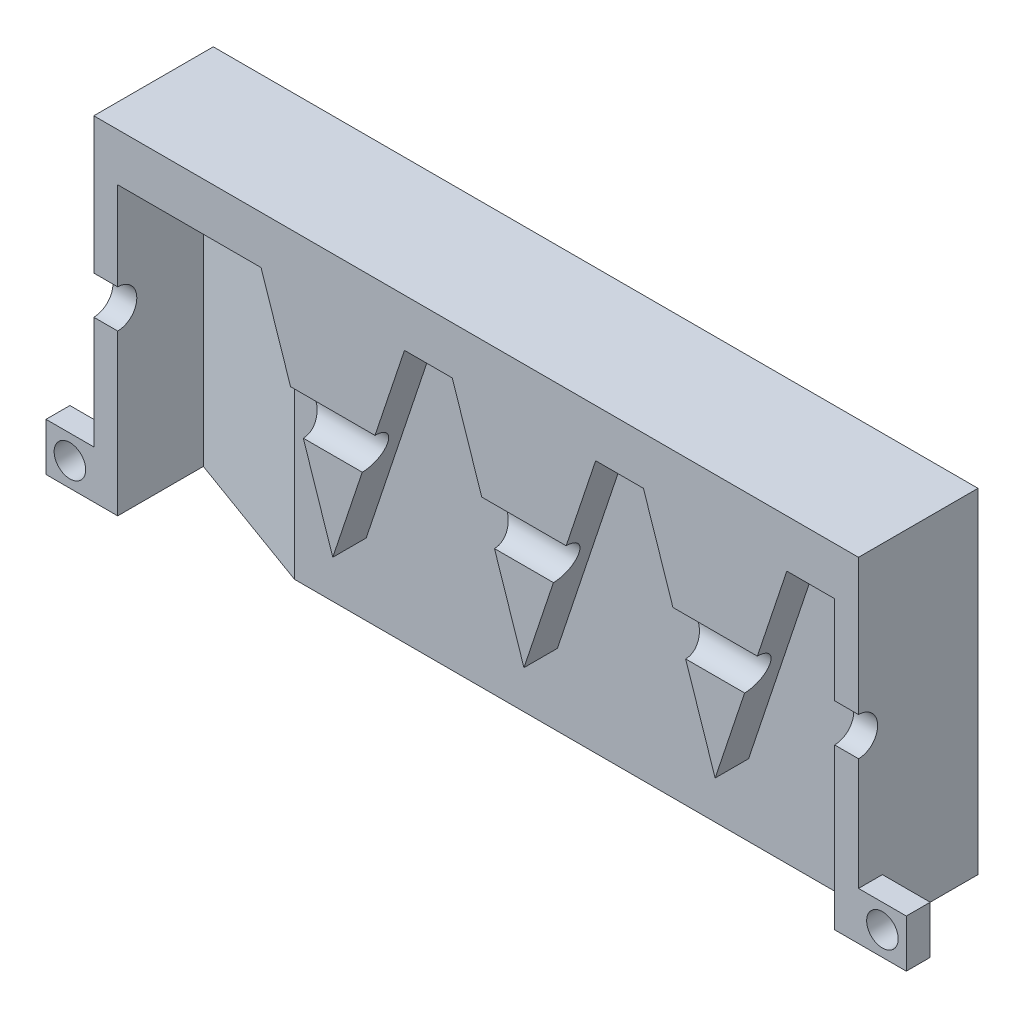
ISO-10303-21;
HEADER;
FILE_DESCRIPTION(('STEP AP214'),'2;1');
FILE_NAME('part.step','',(''),(''),'','','');
FILE_SCHEMA(('AUTOMOTIVE_DESIGN { 1 0 10303 214 1 1 1 1 }'));
ENDSEC;
DATA;
#1=APPLICATION_CONTEXT('core data for automotive mechanical design processes');
#2=APPLICATION_PROTOCOL_DEFINITION('international standard','automotive_design',2000,#1);
#3=PRODUCT_CONTEXT('',#1,'mechanical');
#4=PRODUCT('Part','Part','',(#3));
#5=PRODUCT_RELATED_PRODUCT_CATEGORY('part','',(#4));
#6=PRODUCT_DEFINITION_FORMATION('','',#4);
#7=PRODUCT_DEFINITION_CONTEXT('part definition',#1,'design');
#8=PRODUCT_DEFINITION('design','',#6,#7);
#9=PRODUCT_DEFINITION_SHAPE('','',#8);
#10=(LENGTH_UNIT() NAMED_UNIT(*) SI_UNIT(.MILLI.,.METRE.));
#11=(NAMED_UNIT(*) PLANE_ANGLE_UNIT() SI_UNIT($,.RADIAN.));
#12=(NAMED_UNIT(*) SI_UNIT($,.STERADIAN.) SOLID_ANGLE_UNIT());
#13=UNCERTAINTY_MEASURE_WITH_UNIT(LENGTH_MEASURE(1.E-05),#10,'distance_accuracy_value','');
#14=(GEOMETRIC_REPRESENTATION_CONTEXT(3) GLOBAL_UNCERTAINTY_ASSIGNED_CONTEXT((#13)) GLOBAL_UNIT_ASSIGNED_CONTEXT((#10,
#11,#12)) REPRESENTATION_CONTEXT('',''));
#15=CARTESIAN_POINT('',(0.,0.,0.));
#16=DIRECTION('',(0.,0.,1.));
#17=DIRECTION('',(1.,0.,0.));
#18=AXIS2_PLACEMENT_3D('',#15,#16,#17);
#19=CARTESIAN_POINT('',(0.,0.,-12.5));
#20=DIRECTION('',(0.,0.,1.));
#21=DIRECTION('',(1.,0.,0.));
#22=AXIS2_PLACEMENT_3D('',#19,#20,#21);
#23=PLANE('',#22);
#24=DIRECTION('',(-1.,0.,0.));
#25=VECTOR('',#24,1.);
#26=CARTESIAN_POINT('',(85.6568542494924,16.75,-12.5));
#27=LINE('',#26,#25);
#28=CARTESIAN_POINT('',(48.0833333333333,16.75,-12.5));
#29=VERTEX_POINT('',#28);
#30=CARTESIAN_POINT('',(41.9166666666667,16.75,-12.5));
#31=VERTEX_POINT('',#30);
#32=EDGE_CURVE('E403',#29,#31,#27,.T.);
#33=ORIENTED_EDGE('',*,*,#32,.T.);
#34=DIRECTION('',(0.316227766016838,-0.948683298050514,0.));
#35=VECTOR('',#34,1.);
#36=CARTESIAN_POINT('',(45.,7.50000000000001,-12.5));
#37=LINE('',#36,#35);
#38=CARTESIAN_POINT('',(45.,7.50000000000001,-12.5));
#39=VERTEX_POINT('',#38);
#40=EDGE_CURVE('E425',#31,#39,#37,.T.);
#41=ORIENTED_EDGE('',*,*,#40,.T.);
#42=DIRECTION('',(0.316227766016838,0.948683298050514,0.));
#43=VECTOR('',#42,1.);
#44=CARTESIAN_POINT('',(52.5,30.,-12.5));
#45=LINE('',#44,#43);
#46=EDGE_CURVE('E424',#39,#29,#45,.T.);
#47=ORIENTED_EDGE('',*,*,#46,.T.);
#48=EDGE_LOOP('',(#33,#41,#47));
#49=FACE_BOUND('',#48,.T.);
#50=ADVANCED_FACE('F32',(#49),#23,.T.);
#51=DIRECTION('',(-1.,0.,0.));
#52=VECTOR('',#51,1.);
#53=CARTESIAN_POINT('',(85.6568542494924,16.75,-12.5));
#54=LINE('',#53,#52);
#55=CARTESIAN_POINT('',(28.0833333333333,16.75,-12.5));
#56=VERTEX_POINT('',#55);
#57=CARTESIAN_POINT('',(21.9166666666667,16.75,-12.5));
#58=VERTEX_POINT('',#57);
#59=EDGE_CURVE('E397',#56,#58,#54,.T.);
#60=ORIENTED_EDGE('',*,*,#59,.T.);
#61=DIRECTION('',(0.316227766016838,-0.948683298050514,0.));
#62=VECTOR('',#61,1.);
#63=CARTESIAN_POINT('',(25.,7.50000000000001,-12.5));
#64=LINE('',#63,#62);
#65=CARTESIAN_POINT('',(25.,7.50000000000001,-12.5));
#66=VERTEX_POINT('',#65);
#67=EDGE_CURVE('E433',#58,#66,#64,.T.);
#68=ORIENTED_EDGE('',*,*,#67,.T.);
#69=DIRECTION('',(0.316227766016838,0.948683298050514,0.));
#70=VECTOR('',#69,1.);
#71=CARTESIAN_POINT('',(32.5,30.,-12.5));
#72=LINE('',#71,#70);
#73=EDGE_CURVE('E432',#66,#56,#72,.T.);
#74=ORIENTED_EDGE('',*,*,#73,.T.);
#75=EDGE_LOOP('',(#60,#68,#74));
#76=FACE_BOUND('',#75,.T.);
#77=ADVANCED_FACE('F629',(#76),#23,.T.);
#78=DIRECTION('',(-1.,0.,0.));
#79=VECTOR('',#78,1.);
#80=CARTESIAN_POINT('',(85.6568542494924,16.75,-12.5));
#81=LINE('',#80,#79);
#82=CARTESIAN_POINT('',(68.0833333333333,16.75,-12.5));
#83=VERTEX_POINT('',#82);
#84=CARTESIAN_POINT('',(61.9166666666667,16.75,-12.5));
#85=VERTEX_POINT('',#84);
#86=EDGE_CURVE('E390',#83,#85,#81,.T.);
#87=ORIENTED_EDGE('',*,*,#86,.T.);
#88=DIRECTION('',(0.316227766016838,-0.948683298050514,0.));
#89=VECTOR('',#88,1.);
#90=CARTESIAN_POINT('',(65.,7.50000000000001,-12.5));
#91=LINE('',#90,#89);
#92=CARTESIAN_POINT('',(65.,7.50000000000001,-12.5));
#93=VERTEX_POINT('',#92);
#94=EDGE_CURVE('E441',#85,#93,#91,.T.);
#95=ORIENTED_EDGE('',*,*,#94,.T.);
#96=DIRECTION('',(0.316227766016838,0.948683298050514,0.));
#97=VECTOR('',#96,1.);
#98=CARTESIAN_POINT('',(72.5,30.,-12.5));
#99=LINE('',#98,#97);
#100=EDGE_CURVE('E440',#93,#83,#99,.T.);
#101=ORIENTED_EDGE('',*,*,#100,.T.);
#102=EDGE_LOOP('',(#87,#95,#101));
#103=FACE_BOUND('',#102,.T.);
#104=ADVANCED_FACE('F620',(#103),#23,.T.);
#105=CARTESIAN_POINT('',(82.5,2.5,-12.5));
#106=DIRECTION('',(0.,0.,1.));
#107=DIRECTION('',(1.,0.,0.));
#108=AXIS2_PLACEMENT_3D('',#105,#106,#107);
#109=CIRCLE('',#108,1.65);
#110=CARTESIAN_POINT('',(84.15,2.5,-12.5));
#111=VERTEX_POINT('',#110);
#112=EDGE_CURVE('E415',#111,#111,#109,.F.);
#113=ORIENTED_EDGE('',*,*,#112,.T.);
#114=EDGE_LOOP('',(#113));
#115=FACE_BOUND('',#114,.T.);
#116=DIRECTION('',(1.,0.,0.));
#117=VECTOR('',#116,1.);
#118=CARTESIAN_POINT('',(85.,5.,-12.5));
#119=LINE('',#118,#117);
#120=CARTESIAN_POINT('',(80.,5.,-12.5));
#121=VERTEX_POINT('',#120);
#122=CARTESIAN_POINT('',(85.,5.,-12.5));
#123=VERTEX_POINT('',#122);
#124=EDGE_CURVE('E466',#121,#123,#119,.T.);
#125=ORIENTED_EDGE('',*,*,#124,.F.);
#126=DIRECTION('',(0.,1.,0.));
#127=VECTOR('',#126,1.);
#128=CARTESIAN_POINT('',(80.,35.,-12.5));
#129=LINE('',#128,#127);
#130=CARTESIAN_POINT('',(80.,16.75,-12.5));
#131=VERTEX_POINT('',#130);
#132=EDGE_CURVE('E384',#121,#131,#129,.T.);
#133=ORIENTED_EDGE('',*,*,#132,.T.);
#134=DIRECTION('',(-1.,0.,0.));
#135=VECTOR('',#134,1.);
#136=CARTESIAN_POINT('',(85.6568542494924,16.75,-12.5));
#137=LINE('',#136,#135);
#138=CARTESIAN_POINT('',(77.5,16.75,-12.5));
#139=VERTEX_POINT('',#138);
#140=EDGE_CURVE('E291',#131,#139,#137,.T.);
#141=ORIENTED_EDGE('',*,*,#140,.T.);
#142=DIRECTION('',(0.,1.,0.));
#143=VECTOR('',#142,1.);
#144=CARTESIAN_POINT('',(77.5,30.,-12.5));
#145=LINE('',#144,#143);
#146=CARTESIAN_POINT('',(77.5,0.,-12.5));
#147=VERTEX_POINT('',#146);
#148=EDGE_CURVE('E463',#147,#139,#145,.T.);
#149=ORIENTED_EDGE('',*,*,#148,.F.);
#150=DIRECTION('',(-1.,0.,0.));
#151=VECTOR('',#150,1.);
#152=CARTESIAN_POINT('',(0.,0.,-12.5));
#153=LINE('',#152,#151);
#154=CARTESIAN_POINT('',(85.,0.,-12.5));
#155=VERTEX_POINT('',#154);
#156=EDGE_CURVE('E449',#155,#147,#153,.T.);
#157=ORIENTED_EDGE('',*,*,#156,.F.);
#158=DIRECTION('',(0.,1.,0.));
#159=VECTOR('',#158,1.);
#160=CARTESIAN_POINT('',(85.,0.,-12.5));
#161=LINE('',#160,#159);
#162=EDGE_CURVE('E418',#155,#123,#161,.T.);
#163=ORIENTED_EDGE('',*,*,#162,.T.);
#164=EDGE_LOOP('',(#125,#133,#141,#149,#157,#163));
#165=FACE_BOUND('',#164,.T.);
#166=ADVANCED_FACE('F569',(#115,#165),#23,.T.);
#167=DIRECTION('',(-1.,0.,0.));
#168=VECTOR('',#167,1.);
#169=CARTESIAN_POINT('',(77.5,30.,-12.5));
#170=LINE('',#169,#168);
#171=CARTESIAN_POINT('',(57.5,30.,-12.5));
#172=VERTEX_POINT('',#171);
#173=CARTESIAN_POINT('',(52.5,30.,-12.5));
#174=VERTEX_POINT('',#173);
#175=EDGE_CURVE('E457',#172,#174,#170,.T.);
#176=ORIENTED_EDGE('',*,*,#175,.F.);
#177=CARTESIAN_POINT('',(60.5833333333333,20.75,-12.5));
#178=VERTEX_POINT('',#177);
#179=EDGE_CURVE('E444',#172,#178,#91,.T.);
#180=ORIENTED_EDGE('',*,*,#179,.T.);
#181=DIRECTION('',(-1.,0.,0.));
#182=VECTOR('',#181,1.);
#183=CARTESIAN_POINT('',(85.6568542494924,20.75,-12.5));
#184=LINE('',#183,#182);
#185=CARTESIAN_POINT('',(69.4166666666667,20.75,-12.5));
#186=VERTEX_POINT('',#185);
#187=EDGE_CURVE('E392',#178,#186,#184,.F.);
#188=ORIENTED_EDGE('',*,*,#187,.T.);
#189=CARTESIAN_POINT('',(72.5,30.,-12.5));
#190=VERTEX_POINT('',#189);
#191=EDGE_CURVE('E437',#186,#190,#99,.T.);
#192=ORIENTED_EDGE('',*,*,#191,.T.);
#193=DIRECTION('',(-1.,0.,0.));
#194=VECTOR('',#193,1.);
#195=CARTESIAN_POINT('',(77.5,30.,-12.5));
#196=LINE('',#195,#194);
#197=CARTESIAN_POINT('',(77.5,30.,-12.5));
#198=VERTEX_POINT('',#197);
#199=EDGE_CURVE('E460',#198,#190,#196,.T.);
#200=ORIENTED_EDGE('',*,*,#199,.F.);
#201=CARTESIAN_POINT('',(77.5,20.75,-12.5));
#202=VERTEX_POINT('',#201);
#203=EDGE_CURVE('E389',#202,#198,#145,.T.);
#204=ORIENTED_EDGE('',*,*,#203,.F.);
#205=DIRECTION('',(-1.,0.,0.));
#206=VECTOR('',#205,1.);
#207=CARTESIAN_POINT('',(85.6568542494924,20.75,-12.5));
#208=LINE('',#207,#206);
#209=CARTESIAN_POINT('',(80.,20.75,-12.5));
#210=VERTEX_POINT('',#209);
#211=EDGE_CURVE('E294',#202,#210,#208,.F.);
#212=ORIENTED_EDGE('',*,*,#211,.T.);
#213=CARTESIAN_POINT('',(80.,35.,-12.5));
#214=VERTEX_POINT('',#213);
#215=EDGE_CURVE('E380',#210,#214,#129,.T.);
#216=ORIENTED_EDGE('',*,*,#215,.T.);
#217=DIRECTION('',(-1.,0.,0.));
#218=VECTOR('',#217,1.);
#219=CARTESIAN_POINT('',(0.,35.,-12.5));
#220=LINE('',#219,#218);
#221=CARTESIAN_POINT('',(0.,35.,-12.5));
#222=VERTEX_POINT('',#221);
#223=EDGE_CURVE('E385',#214,#222,#220,.T.);
#224=ORIENTED_EDGE('',*,*,#223,.T.);
#225=DIRECTION('',(0.,-1.,0.));
#226=VECTOR('',#225,1.);
#227=CARTESIAN_POINT('',(0.,35.,-12.5));
#228=LINE('',#227,#226);
#229=CARTESIAN_POINT('',(0.,20.75,-12.5));
#230=VERTEX_POINT('',#229);
#231=EDGE_CURVE('E290',#222,#230,#228,.T.);
#232=ORIENTED_EDGE('',*,*,#231,.T.);
#233=DIRECTION('',(-1.,0.,0.));
#234=VECTOR('',#233,1.);
#235=CARTESIAN_POINT('',(85.6568542494924,20.75,-12.5));
#236=LINE('',#235,#234);
#237=CARTESIAN_POINT('',(2.5,20.75,-12.5));
#238=VERTEX_POINT('',#237);
#239=EDGE_CURVE('E266',#230,#238,#236,.F.);
#240=ORIENTED_EDGE('',*,*,#239,.T.);
#241=DIRECTION('',(0.,-1.,0.));
#242=VECTOR('',#241,1.);
#243=CARTESIAN_POINT('',(2.5,30.,-12.5));
#244=LINE('',#243,#242);
#245=CARTESIAN_POINT('',(2.5,30.,-12.5));
#246=VERTEX_POINT('',#245);
#247=EDGE_CURVE('E275',#246,#238,#244,.T.);
#248=ORIENTED_EDGE('',*,*,#247,.F.);
#249=DIRECTION('',(-1.,0.,0.));
#250=VECTOR('',#249,1.);
#251=CARTESIAN_POINT('',(77.5,30.,-12.5));
#252=LINE('',#251,#250);
#253=CARTESIAN_POINT('',(17.5,30.,-12.5));
#254=VERTEX_POINT('',#253);
#255=EDGE_CURVE('E283',#254,#246,#252,.T.);
#256=ORIENTED_EDGE('',*,*,#255,.F.);
#257=CARTESIAN_POINT('',(20.5833333333333,20.75,-12.5));
#258=VERTEX_POINT('',#257);
#259=EDGE_CURVE('E436',#254,#258,#64,.T.);
#260=ORIENTED_EDGE('',*,*,#259,.T.);
#261=DIRECTION('',(-1.,0.,0.));
#262=VECTOR('',#261,1.);
#263=CARTESIAN_POINT('',(85.6568542494924,20.75,-12.5));
#264=LINE('',#263,#262);
#265=CARTESIAN_POINT('',(29.4166666666667,20.75,-12.5));
#266=VERTEX_POINT('',#265);
#267=EDGE_CURVE('E400',#258,#266,#264,.F.);
#268=ORIENTED_EDGE('',*,*,#267,.T.);
#269=CARTESIAN_POINT('',(32.5,30.,-12.5));
#270=VERTEX_POINT('',#269);
#271=EDGE_CURVE('E429',#266,#270,#72,.T.);
#272=ORIENTED_EDGE('',*,*,#271,.T.);
#273=DIRECTION('',(-1.,0.,0.));
#274=VECTOR('',#273,1.);
#275=CARTESIAN_POINT('',(77.5,30.,-12.5));
#276=LINE('',#275,#274);
#277=CARTESIAN_POINT('',(37.5,30.,-12.5));
#278=VERTEX_POINT('',#277);
#279=EDGE_CURVE('E454',#278,#270,#276,.T.);
#280=ORIENTED_EDGE('',*,*,#279,.F.);
#281=CARTESIAN_POINT('',(40.5833333333333,20.75,-12.5));
#282=VERTEX_POINT('',#281);
#283=EDGE_CURVE('E428',#278,#282,#37,.T.);
#284=ORIENTED_EDGE('',*,*,#283,.T.);
#285=DIRECTION('',(-1.,0.,0.));
#286=VECTOR('',#285,1.);
#287=CARTESIAN_POINT('',(85.6568542494924,20.75,-12.5));
#288=LINE('',#287,#286);
#289=CARTESIAN_POINT('',(49.4166666666667,20.75,-12.5));
#290=VERTEX_POINT('',#289);
#291=EDGE_CURVE('E406',#282,#290,#288,.F.);
#292=ORIENTED_EDGE('',*,*,#291,.T.);
#293=EDGE_CURVE('E421',#290,#174,#45,.T.);
#294=ORIENTED_EDGE('',*,*,#293,.T.);
#295=EDGE_LOOP('',(#176,#180,#188,#192,#200,#204,#212,#216,#224,#232,#240,#248,#256,#260,#268,
#272,#280,#284,#292,#294));
#296=FACE_BOUND('',#295,.T.);
#297=ADVANCED_FACE('F287',(#296),#23,.T.);
#298=CARTESIAN_POINT('',(0.,16.75,-12.5));
#299=VERTEX_POINT('',#298);
#300=CARTESIAN_POINT('',(0.,5.,-12.5));
#301=VERTEX_POINT('',#300);
#302=EDGE_CURVE('E446',#299,#301,#228,.T.);
#303=ORIENTED_EDGE('',*,*,#302,.T.);
#304=DIRECTION('',(-1.,0.,0.));
#305=VECTOR('',#304,1.);
#306=CARTESIAN_POINT('',(-5.,5.,-12.5));
#307=LINE('',#306,#305);
#308=CARTESIAN_POINT('',(-5.,5.,-12.5));
#309=VERTEX_POINT('',#308);
#310=EDGE_CURVE('E412',#301,#309,#307,.T.);
#311=ORIENTED_EDGE('',*,*,#310,.T.);
#312=DIRECTION('',(0.,-1.,0.));
#313=VECTOR('',#312,1.);
#314=CARTESIAN_POINT('',(-5.,0.,-12.5));
#315=LINE('',#314,#313);
#316=CARTESIAN_POINT('',(-5.,0.,-12.5));
#317=VERTEX_POINT('',#316);
#318=EDGE_CURVE('E409',#309,#317,#315,.T.);
#319=ORIENTED_EDGE('',*,*,#318,.T.);
#320=CARTESIAN_POINT('',(2.5,0.,-12.5));
#321=VERTEX_POINT('',#320);
#322=EDGE_CURVE('E452',#321,#317,#153,.T.);
#323=ORIENTED_EDGE('',*,*,#322,.F.);
#324=CARTESIAN_POINT('',(2.5,16.75,-12.5));
#325=VERTEX_POINT('',#324);
#326=EDGE_CURVE('E282',#325,#321,#244,.T.);
#327=ORIENTED_EDGE('',*,*,#326,.F.);
#328=DIRECTION('',(-1.,0.,0.));
#329=VECTOR('',#328,1.);
#330=CARTESIAN_POINT('',(85.6568542494924,16.75,-12.5));
#331=LINE('',#330,#329);
#332=EDGE_CURVE('E268',#325,#299,#331,.T.);
#333=ORIENTED_EDGE('',*,*,#332,.T.);
#334=EDGE_LOOP('',(#303,#311,#319,#323,#327,#333));
#335=FACE_BOUND('',#334,.T.);
#336=CARTESIAN_POINT('',(-2.5,2.5,-12.5));
#337=DIRECTION('',(0.,0.,1.));
#338=DIRECTION('',(1.,0.,0.));
#339=AXIS2_PLACEMENT_3D('',#336,#337,#338);
#340=CIRCLE('',#339,1.65);
#341=CARTESIAN_POINT('',(-0.85,2.5,-12.5));
#342=VERTEX_POINT('',#341);
#343=EDGE_CURVE('E468',#342,#342,#340,.T.);
#344=ORIENTED_EDGE('',*,*,#343,.F.);
#345=EDGE_LOOP('',(#344));
#346=FACE_BOUND('',#345,.T.);
#347=ADVANCED_FACE('F544',(#335,#346),#23,.T.);
#348=CARTESIAN_POINT('',(0.,35.,0.));
#349=DIRECTION('',(1.,0.,0.));
#350=DIRECTION('',(0.,0.,-1.));
#351=AXIS2_PLACEMENT_3D('',#348,#349,#350);
#352=PLANE('',#351);
#353=ORIENTED_EDGE('',*,*,#231,.F.);
#354=DIRECTION('',(0.,0.,1.));
#355=VECTOR('',#354,1.);
#356=CARTESIAN_POINT('',(0.,35.,0.));
#357=LINE('',#356,#355);
#358=CARTESIAN_POINT('',(0.,35.,-25.));
#359=VERTEX_POINT('',#358);
#360=EDGE_CURVE('E301',#359,#222,#357,.T.);
#361=ORIENTED_EDGE('',*,*,#360,.F.);
#362=DIRECTION('',(0.,-1.,0.));
#363=VECTOR('',#362,1.);
#364=CARTESIAN_POINT('',(0.,35.,-25.));
#365=LINE('',#364,#363);
#366=CARTESIAN_POINT('',(0.,0.,-25.));
#367=VERTEX_POINT('',#366);
#368=EDGE_CURVE('E522',#359,#367,#365,.T.);
#369=ORIENTED_EDGE('',*,*,#368,.T.);
#370=DIRECTION('',(0.,0.,1.));
#371=VECTOR('',#370,1.);
#372=CARTESIAN_POINT('',(0.,0.,0.));
#373=LINE('',#372,#371);
#374=CARTESIAN_POINT('',(0.,0.,-15.));
#375=VERTEX_POINT('',#374);
#376=EDGE_CURVE('E48',#367,#375,#373,.T.);
#377=ORIENTED_EDGE('',*,*,#376,.T.);
#378=DIRECTION('',(0.,-1.,0.));
#379=VECTOR('',#378,1.);
#380=CARTESIAN_POINT('',(0.,5.,-15.));
#381=LINE('',#380,#379);
#382=CARTESIAN_POINT('',(0.,5.,-15.));
#383=VERTEX_POINT('',#382);
#384=EDGE_CURVE('E355',#383,#375,#381,.T.);
#385=ORIENTED_EDGE('',*,*,#384,.F.);
#386=DIRECTION('',(0.,0.,-1.));
#387=VECTOR('',#386,1.);
#388=CARTESIAN_POINT('',(0.,5.,-10.));
#389=LINE('',#388,#387);
#390=EDGE_CURVE('E356',#301,#383,#389,.T.);
#391=ORIENTED_EDGE('',*,*,#390,.F.);
#392=ORIENTED_EDGE('',*,*,#302,.F.);
#393=CARTESIAN_POINT('',(0.,18.75,-12.5));
#394=DIRECTION('',(-1.,0.,0.));
#395=DIRECTION('',(0.,0.,1.));
#396=AXIS2_PLACEMENT_3D('',#393,#394,#395);
#397=CIRCLE('',#396,2.);
#398=EDGE_CURVE('E11',#230,#299,#397,.T.);
#399=ORIENTED_EDGE('',*,*,#398,.F.);
#400=EDGE_LOOP('',(#353,#361,#369,#377,#385,#391,#392,#399));
#401=FACE_BOUND('',#400,.T.);
#402=ADVANCED_FACE('F539',(#401),#352,.F.);
#403=CARTESIAN_POINT('',(80.,35.,0.));
#404=DIRECTION('',(-1.,0.,0.));
#405=DIRECTION('',(0.,0.,1.));
#406=AXIS2_PLACEMENT_3D('',#403,#404,#405);
#407=PLANE('',#406);
#408=ORIENTED_EDGE('',*,*,#132,.F.);
#409=DIRECTION('',(0.,0.,-1.));
#410=VECTOR('',#409,1.);
#411=CARTESIAN_POINT('',(80.,5.,-10.));
#412=LINE('',#411,#410);
#413=CARTESIAN_POINT('',(80.,5.,-15.));
#414=VERTEX_POINT('',#413);
#415=EDGE_CURVE('E348',#121,#414,#412,.T.);
#416=ORIENTED_EDGE('',*,*,#415,.T.);
#417=DIRECTION('',(0.,-1.,0.));
#418=VECTOR('',#417,1.);
#419=CARTESIAN_POINT('',(80.,5.,-15.));
#420=LINE('',#419,#418);
#421=CARTESIAN_POINT('',(80.,0.,-15.));
#422=VERTEX_POINT('',#421);
#423=EDGE_CURVE('E347',#414,#422,#420,.T.);
#424=ORIENTED_EDGE('',*,*,#423,.T.);
#425=DIRECTION('',(0.,0.,-1.));
#426=VECTOR('',#425,1.);
#427=CARTESIAN_POINT('',(80.,0.,0.));
#428=LINE('',#427,#426);
#429=CARTESIAN_POINT('',(80.,0.,-25.));
#430=VERTEX_POINT('',#429);
#431=EDGE_CURVE('E305',#422,#430,#428,.T.);
#432=ORIENTED_EDGE('',*,*,#431,.T.);
#433=DIRECTION('',(0.,-1.,0.));
#434=VECTOR('',#433,1.);
#435=CARTESIAN_POINT('',(80.,35.,-25.));
#436=LINE('',#435,#434);
#437=CARTESIAN_POINT('',(80.,35.,-25.));
#438=VERTEX_POINT('',#437);
#439=EDGE_CURVE('E471',#438,#430,#436,.T.);
#440=ORIENTED_EDGE('',*,*,#439,.F.);
#441=DIRECTION('',(0.,0.,-1.));
#442=VECTOR('',#441,1.);
#443=CARTESIAN_POINT('',(80.,35.,0.));
#444=LINE('',#443,#442);
#445=EDGE_CURVE('E299',#214,#438,#444,.T.);
#446=ORIENTED_EDGE('',*,*,#445,.F.);
#447=ORIENTED_EDGE('',*,*,#215,.F.);
#448=CARTESIAN_POINT('',(80.,18.75,-12.5));
#449=DIRECTION('',(-1.,0.,0.));
#450=DIRECTION('',(0.,0.,1.));
#451=AXIS2_PLACEMENT_3D('',#448,#449,#450);
#452=CIRCLE('',#451,2.);
#453=EDGE_CURVE('E41',#131,#210,#452,.F.);
#454=ORIENTED_EDGE('',*,*,#453,.F.);
#455=EDGE_LOOP('',(#408,#416,#424,#432,#440,#446,#447,#454));
#456=FACE_BOUND('',#455,.T.);
#457=ADVANCED_FACE('F381',(#456),#407,.F.);
#458=CARTESIAN_POINT('',(0.,35.,0.));
#459=DIRECTION('',(0.,-1.,0.));
#460=DIRECTION('',(0.,0.,-1.));
#461=AXIS2_PLACEMENT_3D('',#458,#459,#460);
#462=PLANE('',#461);
#463=ORIENTED_EDGE('',*,*,#223,.F.);
#464=ORIENTED_EDGE('',*,*,#445,.T.);
#465=DIRECTION('',(-1.,0.,0.));
#466=VECTOR('',#465,1.);
#467=CARTESIAN_POINT('',(0.,35.,-25.));
#468=LINE('',#467,#466);
#469=EDGE_CURVE('E302',#438,#359,#468,.T.);
#470=ORIENTED_EDGE('',*,*,#469,.T.);
#471=ORIENTED_EDGE('',*,*,#360,.T.);
#472=EDGE_LOOP('',(#463,#464,#470,#471));
#473=FACE_BOUND('',#472,.T.);
#474=ADVANCED_FACE('F34',(#473),#462,.F.);
#475=CARTESIAN_POINT('',(0.,0.,0.));
#476=DIRECTION('',(0.,-1.,0.));
#477=DIRECTION('',(0.,0.,-1.));
#478=AXIS2_PLACEMENT_3D('',#475,#476,#477);
#479=PLANE('',#478);
#480=DIRECTION('',(0.,0.,-1.));
#481=VECTOR('',#480,1.);
#482=CARTESIAN_POINT('',(85.,0.,-10.));
#483=LINE('',#482,#481);
#484=CARTESIAN_POINT('',(85.,0.,-15.));
#485=VERTEX_POINT('',#484);
#486=EDGE_CURVE('E76',#155,#485,#483,.T.);
#487=ORIENTED_EDGE('',*,*,#486,.F.);
#488=ORIENTED_EDGE('',*,*,#156,.T.);
#489=DIRECTION('',(0.,0.,1.));
#490=VECTOR('',#489,1.);
#491=CARTESIAN_POINT('',(77.5,0.,-16.));
#492=LINE('',#491,#490);
#493=CARTESIAN_POINT('',(77.5,0.,-16.));
#494=VERTEX_POINT('',#493);
#495=EDGE_CURVE('E311',#494,#147,#492,.T.);
#496=ORIENTED_EDGE('',*,*,#495,.F.);
#497=DIRECTION('',(-1.,0.,0.));
#498=VECTOR('',#497,1.);
#499=CARTESIAN_POINT('',(77.5,0.,-16.));
#500=LINE('',#499,#498);
#501=CARTESIAN_POINT('',(17.5,0.,-16.));
#502=VERTEX_POINT('',#501);
#503=EDGE_CURVE('E318',#494,#502,#500,.T.);
#504=ORIENTED_EDGE('',*,*,#503,.T.);
#505=DIRECTION('',(0.939692620785911,0.,0.342020143325662));
#506=VECTOR('',#505,1.);
#507=CARTESIAN_POINT('',(2.5,0.,-21.4595535139929));
#508=LINE('',#507,#506);
#509=CARTESIAN_POINT('',(2.5,0.,-21.4595535139929));
#510=VERTEX_POINT('',#509);
#511=EDGE_CURVE('E342',#510,#502,#508,.T.);
#512=ORIENTED_EDGE('',*,*,#511,.F.);
#513=DIRECTION('',(0.,0.,1.));
#514=VECTOR('',#513,1.);
#515=CARTESIAN_POINT('',(2.5,0.,-16.));
#516=LINE('',#515,#514);
#517=EDGE_CURVE('E314',#510,#321,#516,.T.);
#518=ORIENTED_EDGE('',*,*,#517,.T.);
#519=ORIENTED_EDGE('',*,*,#322,.T.);
#520=DIRECTION('',(0.,0.,-1.));
#521=VECTOR('',#520,1.);
#522=CARTESIAN_POINT('',(-5.,0.,-10.));
#523=LINE('',#522,#521);
#524=CARTESIAN_POINT('',(-5.,0.,-15.));
#525=VERTEX_POINT('',#524);
#526=EDGE_CURVE('E351',#317,#525,#523,.T.);
#527=ORIENTED_EDGE('',*,*,#526,.T.);
#528=DIRECTION('',(1.,0.,0.));
#529=VECTOR('',#528,1.);
#530=CARTESIAN_POINT('',(-5.,0.,-15.));
#531=LINE('',#530,#529);
#532=EDGE_CURVE('E475',#525,#375,#531,.T.);
#533=ORIENTED_EDGE('',*,*,#532,.T.);
#534=ORIENTED_EDGE('',*,*,#376,.F.);
#535=DIRECTION('',(-1.,0.,0.));
#536=VECTOR('',#535,1.);
#537=CARTESIAN_POINT('',(0.,0.,-25.));
#538=LINE('',#537,#536);
#539=EDGE_CURVE('E304',#430,#367,#538,.T.);
#540=ORIENTED_EDGE('',*,*,#539,.F.);
#541=ORIENTED_EDGE('',*,*,#431,.F.);
#542=DIRECTION('',(-1.,0.,0.));
#543=VECTOR('',#542,1.);
#544=CARTESIAN_POINT('',(85.,0.,-15.));
#545=LINE('',#544,#543);
#546=EDGE_CURVE('E487',#485,#422,#545,.T.);
#547=ORIENTED_EDGE('',*,*,#546,.F.);
#548=EDGE_LOOP('',(#487,#488,#496,#504,#512,#518,#519,#527,#533,#534,#540,#541,#547));
#549=FACE_BOUND('',#548,.T.);
#550=ADVANCED_FACE('F533',(#549),#479,.T.);
#551=CARTESIAN_POINT('',(77.5,30.,-16.));
#552=DIRECTION('',(0.,-1.,0.));
#553=DIRECTION('',(-1.,0.,0.));
#554=AXIS2_PLACEMENT_3D('',#551,#552,#553);
#555=PLANE('',#554);
#556=DIRECTION('',(0.,0.,1.));
#557=VECTOR('',#556,1.);
#558=CARTESIAN_POINT('',(17.5,30.,-43.0416345659799));
#559=LINE('',#558,#557);
#560=CARTESIAN_POINT('',(17.5,30.,-16.));
#561=VERTEX_POINT('',#560);
#562=EDGE_CURVE('E340',#561,#254,#559,.T.);
#563=ORIENTED_EDGE('',*,*,#562,.T.);
#564=ORIENTED_EDGE('',*,*,#255,.T.);
#565=DIRECTION('',(0.,0.,1.));
#566=VECTOR('',#565,1.);
#567=CARTESIAN_POINT('',(2.5,30.,-16.));
#568=LINE('',#567,#566);
#569=CARTESIAN_POINT('',(2.5,30.,-21.4595535139929));
#570=VERTEX_POINT('',#569);
#571=EDGE_CURVE('E278',#570,#246,#568,.T.);
#572=ORIENTED_EDGE('',*,*,#571,.F.);
#573=DIRECTION('',(-0.939692620785911,0.,-0.342020143325662));
#574=VECTOR('',#573,1.);
#575=CARTESIAN_POINT('',(2.5,30.,-21.4595535139929));
#576=LINE('',#575,#574);
#577=EDGE_CURVE('E490',#561,#570,#576,.T.);
#578=ORIENTED_EDGE('',*,*,#577,.F.);
#579=EDGE_LOOP('',(#563,#564,#572,#578));
#580=FACE_BOUND('',#579,.T.);
#581=ADVANCED_FACE('F577',(#580),#555,.T.);
#582=CARTESIAN_POINT('',(2.5,30.,-16.));
#583=DIRECTION('',(1.,0.,0.));
#584=DIRECTION('',(0.,-1.,0.));
#585=AXIS2_PLACEMENT_3D('',#582,#583,#584);
#586=PLANE('',#585);
#587=ORIENTED_EDGE('',*,*,#571,.T.);
#588=ORIENTED_EDGE('',*,*,#247,.T.);
#589=CARTESIAN_POINT('',(2.5,18.75,-12.5));
#590=DIRECTION('',(1.,0.,0.));
#591=DIRECTION('',(0.,0.,-1.));
#592=AXIS2_PLACEMENT_3D('',#589,#590,#591);
#593=CIRCLE('',#592,2.);
#594=EDGE_CURVE('E262',#325,#238,#593,.T.);
#595=ORIENTED_EDGE('',*,*,#594,.F.);
#596=ORIENTED_EDGE('',*,*,#326,.T.);
#597=ORIENTED_EDGE('',*,*,#517,.F.);
#598=DIRECTION('',(0.,1.,0.));
#599=VECTOR('',#598,1.);
#600=CARTESIAN_POINT('',(2.5,-15.9626665871386,-21.4595535139929));
#601=LINE('',#600,#599);
#602=EDGE_CURVE('E496',#510,#570,#601,.T.);
#603=ORIENTED_EDGE('',*,*,#602,.T.);
#604=EDGE_LOOP('',(#587,#588,#595,#596,#597,#603));
#605=FACE_BOUND('',#604,.T.);
#606=ADVANCED_FACE('F276',(#605),#586,.T.);
#607=DIRECTION('',(0.,0.,1.));
#608=VECTOR('',#607,1.);
#609=CARTESIAN_POINT('',(37.5,30.,-43.0416345659799));
#610=LINE('',#609,#608);
#611=CARTESIAN_POINT('',(37.5,30.,-16.));
#612=VERTEX_POINT('',#611);
#613=EDGE_CURVE('E332',#612,#278,#610,.T.);
#614=ORIENTED_EDGE('',*,*,#613,.T.);
#615=ORIENTED_EDGE('',*,*,#279,.T.);
#616=DIRECTION('',(0.,0.,1.));
#617=VECTOR('',#616,1.);
#618=CARTESIAN_POINT('',(32.5,30.,-43.0416345659799));
#619=LINE('',#618,#617);
#620=CARTESIAN_POINT('',(32.5,30.,-16.));
#621=VERTEX_POINT('',#620);
#622=EDGE_CURVE('E335',#621,#270,#619,.T.);
#623=ORIENTED_EDGE('',*,*,#622,.F.);
#624=DIRECTION('',(1.,0.,0.));
#625=VECTOR('',#624,1.);
#626=CARTESIAN_POINT('',(77.5,30.,-16.));
#627=LINE('',#626,#625);
#628=EDGE_CURVE('E516',#621,#612,#627,.T.);
#629=ORIENTED_EDGE('',*,*,#628,.T.);
#630=EDGE_LOOP('',(#614,#615,#623,#629));
#631=FACE_BOUND('',#630,.T.);
#632=ADVANCED_FACE('F585',(#631),#555,.T.);
#633=DIRECTION('',(0.,0.,1.));
#634=VECTOR('',#633,1.);
#635=CARTESIAN_POINT('',(57.5,30.,-43.0416345659799));
#636=LINE('',#635,#634);
#637=CARTESIAN_POINT('',(57.5,30.,-16.));
#638=VERTEX_POINT('',#637);
#639=EDGE_CURVE('E324',#638,#172,#636,.T.);
#640=ORIENTED_EDGE('',*,*,#639,.T.);
#641=ORIENTED_EDGE('',*,*,#175,.T.);
#642=DIRECTION('',(0.,0.,1.));
#643=VECTOR('',#642,1.);
#644=CARTESIAN_POINT('',(52.5,30.,-43.0416345659799));
#645=LINE('',#644,#643);
#646=CARTESIAN_POINT('',(52.5,30.,-16.));
#647=VERTEX_POINT('',#646);
#648=EDGE_CURVE('E327',#647,#174,#645,.T.);
#649=ORIENTED_EDGE('',*,*,#648,.F.);
#650=EDGE_CURVE('E514',#647,#638,#627,.T.);
#651=ORIENTED_EDGE('',*,*,#650,.T.);
#652=EDGE_LOOP('',(#640,#641,#649,#651));
#653=FACE_BOUND('',#652,.T.);
#654=ADVANCED_FACE('F749',(#653),#555,.T.);
#655=DIRECTION('',(0.,0.,1.));
#656=VECTOR('',#655,1.);
#657=CARTESIAN_POINT('',(77.5,30.,-16.));
#658=LINE('',#657,#656);
#659=CARTESIAN_POINT('',(77.5,30.,-16.));
#660=VERTEX_POINT('',#659);
#661=EDGE_CURVE('E308',#660,#198,#658,.T.);
#662=ORIENTED_EDGE('',*,*,#661,.T.);
#663=ORIENTED_EDGE('',*,*,#199,.T.);
#664=DIRECTION('',(0.,0.,1.));
#665=VECTOR('',#664,1.);
#666=CARTESIAN_POINT('',(72.5,30.,-43.0416345659799));
#667=LINE('',#666,#665);
#668=CARTESIAN_POINT('',(72.5,30.,-16.));
#669=VERTEX_POINT('',#668);
#670=EDGE_CURVE('E319',#669,#190,#667,.T.);
#671=ORIENTED_EDGE('',*,*,#670,.F.);
#672=EDGE_CURVE('E511',#669,#660,#627,.T.);
#673=ORIENTED_EDGE('',*,*,#672,.T.);
#674=EDGE_LOOP('',(#662,#663,#671,#673));
#675=FACE_BOUND('',#674,.T.);
#676=ADVANCED_FACE('F584',(#675),#555,.T.);
#677=CARTESIAN_POINT('',(77.5,30.,-16.));
#678=DIRECTION('',(-1.,0.,0.));
#679=DIRECTION('',(0.,1.,0.));
#680=AXIS2_PLACEMENT_3D('',#677,#678,#679);
#681=PLANE('',#680);
#682=ORIENTED_EDGE('',*,*,#495,.T.);
#683=ORIENTED_EDGE('',*,*,#148,.T.);
#684=CARTESIAN_POINT('',(77.5,18.75,-12.5));
#685=DIRECTION('',(-1.,0.,0.));
#686=DIRECTION('',(0.,0.,1.));
#687=AXIS2_PLACEMENT_3D('',#684,#685,#686);
#688=CIRCLE('',#687,2.);
#689=EDGE_CURVE('E271',#202,#139,#688,.T.);
#690=ORIENTED_EDGE('',*,*,#689,.F.);
#691=ORIENTED_EDGE('',*,*,#203,.T.);
#692=ORIENTED_EDGE('',*,*,#661,.F.);
#693=DIRECTION('',(0.,-1.,0.));
#694=VECTOR('',#693,1.);
#695=CARTESIAN_POINT('',(77.5,30.,-16.));
#696=LINE('',#695,#694);
#697=EDGE_CURVE('E517',#660,#494,#696,.T.);
#698=ORIENTED_EDGE('',*,*,#697,.T.);
#699=EDGE_LOOP('',(#682,#683,#690,#691,#692,#698));
#700=FACE_BOUND('',#699,.T.);
#701=ADVANCED_FACE('F679',(#700),#681,.T.);
#702=CARTESIAN_POINT('',(65.,7.50000000000001,-43.0416345659799));
#703=DIRECTION('',(0.948683298050514,0.316227766016838,0.));
#704=DIRECTION('',(0.316227766016838,-0.948683298050514,0.));
#705=AXIS2_PLACEMENT_3D('',#702,#703,#704);
#706=PLANE('',#705);
#707=ORIENTED_EDGE('',*,*,#179,.F.);
#708=ORIENTED_EDGE('',*,*,#639,.F.);
#709=DIRECTION('',(0.316227766016838,-0.948683298050514,0.));
#710=VECTOR('',#709,1.);
#711=CARTESIAN_POINT('',(65.,7.50000000000001,-16.));
#712=LINE('',#711,#710);
#713=CARTESIAN_POINT('',(65.,7.50000000000001,-16.));
#714=VERTEX_POINT('',#713);
#715=EDGE_CURVE('E322',#638,#714,#712,.T.);
#716=ORIENTED_EDGE('',*,*,#715,.T.);
#717=DIRECTION('',(0.,0.,1.));
#718=VECTOR('',#717,1.);
#719=CARTESIAN_POINT('',(65.,7.50000000000001,-43.0416345659799));
#720=LINE('',#719,#718);
#721=EDGE_CURVE('E321',#714,#93,#720,.T.);
#722=ORIENTED_EDGE('',*,*,#721,.T.);
#723=ORIENTED_EDGE('',*,*,#94,.F.);
#724=CARTESIAN_POINT('',(61.25,18.75,-12.5));
#725=DIRECTION('',(0.948683298050514,0.316227766016838,0.));
#726=DIRECTION('',(-0.316227766016838,0.948683298050514,0.));
#727=AXIS2_PLACEMENT_3D('',#724,#725,#726);
#728=ELLIPSE('',#727,2.10818510677892,2.);
#729=EDGE_CURVE('E359',#85,#178,#728,.T.);
#730=ORIENTED_EDGE('',*,*,#729,.T.);
#731=EDGE_LOOP('',(#707,#708,#716,#722,#723,#730));
#732=FACE_BOUND('',#731,.T.);
#733=ADVANCED_FACE('F676',(#732),#706,.F.);
#734=CARTESIAN_POINT('',(72.5,30.,-43.0416345659799));
#735=DIRECTION('',(-0.948683298050514,0.316227766016838,0.));
#736=DIRECTION('',(0.316227766016838,0.948683298050514,0.));
#737=AXIS2_PLACEMENT_3D('',#734,#735,#736);
#738=PLANE('',#737);
#739=ORIENTED_EDGE('',*,*,#100,.F.);
#740=ORIENTED_EDGE('',*,*,#721,.F.);
#741=DIRECTION('',(0.316227766016838,0.948683298050514,0.));
#742=VECTOR('',#741,1.);
#743=CARTESIAN_POINT('',(72.5,30.,-16.));
#744=LINE('',#743,#742);
#745=EDGE_CURVE('E508',#714,#669,#744,.T.);
#746=ORIENTED_EDGE('',*,*,#745,.T.);
#747=ORIENTED_EDGE('',*,*,#670,.T.);
#748=ORIENTED_EDGE('',*,*,#191,.F.);
#749=CARTESIAN_POINT('',(68.75,18.75,-12.5));
#750=DIRECTION('',(-0.948683298050514,0.316227766016838,0.));
#751=DIRECTION('',(-0.316227766016838,-0.948683298050514,0.));
#752=AXIS2_PLACEMENT_3D('',#749,#750,#751);
#753=ELLIPSE('',#752,2.10818510677892,2.);
#754=EDGE_CURVE('E361',#186,#83,#753,.T.);
#755=ORIENTED_EDGE('',*,*,#754,.T.);
#756=EDGE_LOOP('',(#739,#740,#746,#747,#748,#755));
#757=FACE_BOUND('',#756,.T.);
#758=ADVANCED_FACE('F672',(#757),#738,.F.);
#759=CARTESIAN_POINT('',(25.,7.50000000000001,-43.0416345659799));
#760=DIRECTION('',(0.948683298050514,0.316227766016838,0.));
#761=DIRECTION('',(0.316227766016838,-0.948683298050514,0.));
#762=AXIS2_PLACEMENT_3D('',#759,#760,#761);
#763=PLANE('',#762);
#764=ORIENTED_EDGE('',*,*,#259,.F.);
#765=ORIENTED_EDGE('',*,*,#562,.F.);
#766=DIRECTION('',(0.316227766016838,-0.948683298050514,0.));
#767=VECTOR('',#766,1.);
#768=CARTESIAN_POINT('',(25.,7.50000000000001,-16.));
#769=LINE('',#768,#767);
#770=CARTESIAN_POINT('',(25.,7.50000000000001,-16.));
#771=VERTEX_POINT('',#770);
#772=EDGE_CURVE('E338',#561,#771,#769,.T.);
#773=ORIENTED_EDGE('',*,*,#772,.T.);
#774=DIRECTION('',(0.,0.,1.));
#775=VECTOR('',#774,1.);
#776=CARTESIAN_POINT('',(25.,7.50000000000001,-43.0416345659799));
#777=LINE('',#776,#775);
#778=EDGE_CURVE('E337',#771,#66,#777,.T.);
#779=ORIENTED_EDGE('',*,*,#778,.T.);
#780=ORIENTED_EDGE('',*,*,#67,.F.);
#781=CARTESIAN_POINT('',(21.25,18.75,-12.5));
#782=DIRECTION('',(0.948683298050514,0.316227766016838,0.));
#783=DIRECTION('',(-0.316227766016838,0.948683298050514,0.));
#784=AXIS2_PLACEMENT_3D('',#781,#782,#783);
#785=ELLIPSE('',#784,2.10818510677892,2.);
#786=EDGE_CURVE('E363',#58,#258,#785,.T.);
#787=ORIENTED_EDGE('',*,*,#786,.T.);
#788=EDGE_LOOP('',(#764,#765,#773,#779,#780,#787));
#789=FACE_BOUND('',#788,.T.);
#790=ADVANCED_FACE('F668',(#789),#763,.F.);
#791=CARTESIAN_POINT('',(32.5,30.,-43.0416345659799));
#792=DIRECTION('',(-0.948683298050514,0.316227766016838,0.));
#793=DIRECTION('',(0.316227766016838,0.948683298050514,0.));
#794=AXIS2_PLACEMENT_3D('',#791,#792,#793);
#795=PLANE('',#794);
#796=ORIENTED_EDGE('',*,*,#73,.F.);
#797=ORIENTED_EDGE('',*,*,#778,.F.);
#798=DIRECTION('',(0.316227766016838,0.948683298050514,0.));
#799=VECTOR('',#798,1.);
#800=CARTESIAN_POINT('',(32.5,30.,-16.));
#801=LINE('',#800,#799);
#802=EDGE_CURVE('E334',#771,#621,#801,.T.);
#803=ORIENTED_EDGE('',*,*,#802,.T.);
#804=ORIENTED_EDGE('',*,*,#622,.T.);
#805=ORIENTED_EDGE('',*,*,#271,.F.);
#806=CARTESIAN_POINT('',(28.75,18.75,-12.5));
#807=DIRECTION('',(-0.948683298050514,0.316227766016838,0.));
#808=DIRECTION('',(-0.316227766016838,-0.948683298050514,0.));
#809=AXIS2_PLACEMENT_3D('',#806,#807,#808);
#810=ELLIPSE('',#809,2.10818510677892,2.);
#811=EDGE_CURVE('E365',#266,#56,#810,.T.);
#812=ORIENTED_EDGE('',*,*,#811,.T.);
#813=EDGE_LOOP('',(#796,#797,#803,#804,#805,#812));
#814=FACE_BOUND('',#813,.T.);
#815=ADVANCED_FACE('F660',(#814),#795,.F.);
#816=CARTESIAN_POINT('',(45.,7.50000000000001,-43.0416345659799));
#817=DIRECTION('',(0.948683298050514,0.316227766016838,0.));
#818=DIRECTION('',(0.316227766016838,-0.948683298050514,0.));
#819=AXIS2_PLACEMENT_3D('',#816,#817,#818);
#820=PLANE('',#819);
#821=ORIENTED_EDGE('',*,*,#283,.F.);
#822=ORIENTED_EDGE('',*,*,#613,.F.);
#823=DIRECTION('',(0.316227766016838,-0.948683298050514,0.));
#824=VECTOR('',#823,1.);
#825=CARTESIAN_POINT('',(45.,7.50000000000001,-16.));
#826=LINE('',#825,#824);
#827=CARTESIAN_POINT('',(45.,7.50000000000001,-16.));
#828=VERTEX_POINT('',#827);
#829=EDGE_CURVE('E330',#612,#828,#826,.T.);
#830=ORIENTED_EDGE('',*,*,#829,.T.);
#831=DIRECTION('',(0.,0.,1.));
#832=VECTOR('',#831,1.);
#833=CARTESIAN_POINT('',(45.,7.50000000000001,-43.0416345659799));
#834=LINE('',#833,#832);
#835=EDGE_CURVE('E329',#828,#39,#834,.T.);
#836=ORIENTED_EDGE('',*,*,#835,.T.);
#837=ORIENTED_EDGE('',*,*,#40,.F.);
#838=CARTESIAN_POINT('',(41.25,18.75,-12.5));
#839=DIRECTION('',(0.948683298050514,0.316227766016838,0.));
#840=DIRECTION('',(-0.316227766016838,0.948683298050514,0.));
#841=AXIS2_PLACEMENT_3D('',#838,#839,#840);
#842=ELLIPSE('',#841,2.10818510677892,2.);
#843=EDGE_CURVE('E367',#31,#282,#842,.T.);
#844=ORIENTED_EDGE('',*,*,#843,.T.);
#845=EDGE_LOOP('',(#821,#822,#830,#836,#837,#844));
#846=FACE_BOUND('',#845,.T.);
#847=ADVANCED_FACE('F656',(#846),#820,.F.);
#848=CARTESIAN_POINT('',(52.5,30.,-43.0416345659799));
#849=DIRECTION('',(-0.948683298050514,0.316227766016838,0.));
#850=DIRECTION('',(0.316227766016838,0.948683298050514,0.));
#851=AXIS2_PLACEMENT_3D('',#848,#849,#850);
#852=PLANE('',#851);
#853=ORIENTED_EDGE('',*,*,#46,.F.);
#854=ORIENTED_EDGE('',*,*,#835,.F.);
#855=DIRECTION('',(0.316227766016838,0.948683298050514,0.));
#856=VECTOR('',#855,1.);
#857=CARTESIAN_POINT('',(52.5,30.,-16.));
#858=LINE('',#857,#856);
#859=EDGE_CURVE('E326',#828,#647,#858,.T.);
#860=ORIENTED_EDGE('',*,*,#859,.T.);
#861=ORIENTED_EDGE('',*,*,#648,.T.);
#862=ORIENTED_EDGE('',*,*,#293,.F.);
#863=CARTESIAN_POINT('',(48.75,18.75,-12.5));
#864=DIRECTION('',(-0.948683298050514,0.316227766016838,0.));
#865=DIRECTION('',(-0.316227766016838,-0.948683298050514,0.));
#866=AXIS2_PLACEMENT_3D('',#863,#864,#865);
#867=ELLIPSE('',#866,2.10818510677892,2.);
#868=EDGE_CURVE('E369',#290,#29,#867,.T.);
#869=ORIENTED_EDGE('',*,*,#868,.T.);
#870=EDGE_LOOP('',(#853,#854,#860,#861,#862,#869));
#871=FACE_BOUND('',#870,.T.);
#872=ADVANCED_FACE('F652',(#871),#852,.F.);
#873=CARTESIAN_POINT('',(85.,5.,-10.));
#874=DIRECTION('',(0.,1.,0.));
#875=DIRECTION('',(0.,0.,1.));
#876=AXIS2_PLACEMENT_3D('',#873,#874,#875);
#877=PLANE('',#876);
#878=ORIENTED_EDGE('',*,*,#415,.F.);
#879=ORIENTED_EDGE('',*,*,#124,.T.);
#880=DIRECTION('',(0.,0.,-1.));
#881=VECTOR('',#880,1.);
#882=CARTESIAN_POINT('',(85.,5.,-10.));
#883=LINE('',#882,#881);
#884=CARTESIAN_POINT('',(85.,5.,-15.));
#885=VERTEX_POINT('',#884);
#886=EDGE_CURVE('E68',#123,#885,#883,.T.);
#887=ORIENTED_EDGE('',*,*,#886,.T.);
#888=DIRECTION('',(-1.,0.,0.));
#889=VECTOR('',#888,1.);
#890=CARTESIAN_POINT('',(85.,5.,-15.));
#891=LINE('',#890,#889);
#892=EDGE_CURVE('E345',#885,#414,#891,.T.);
#893=ORIENTED_EDGE('',*,*,#892,.T.);
#894=EDGE_LOOP('',(#878,#879,#887,#893));
#895=FACE_BOUND('',#894,.T.);
#896=ADVANCED_FACE('F655',(#895),#877,.T.);
#897=CARTESIAN_POINT('',(85.,0.,0.));
#898=DIRECTION('',(-1.,0.,0.));
#899=DIRECTION('',(0.,0.,1.));
#900=AXIS2_PLACEMENT_3D('',#897,#898,#899);
#901=PLANE('',#900);
#902=ORIENTED_EDGE('',*,*,#162,.F.);
#903=ORIENTED_EDGE('',*,*,#486,.T.);
#904=DIRECTION('',(0.,-1.,0.));
#905=VECTOR('',#904,1.);
#906=CARTESIAN_POINT('',(85.,5.,-15.));
#907=LINE('',#906,#905);
#908=EDGE_CURVE('E344',#885,#485,#907,.T.);
#909=ORIENTED_EDGE('',*,*,#908,.F.);
#910=ORIENTED_EDGE('',*,*,#886,.F.);
#911=EDGE_LOOP('',(#902,#903,#909,#910));
#912=FACE_BOUND('',#911,.T.);
#913=ADVANCED_FACE('F557',(#912),#901,.F.);
#914=CARTESIAN_POINT('',(82.5,2.5,-19.6669047558312));
#915=DIRECTION('',(0.,0.,1.));
#916=DIRECTION('',(1.,0.,0.));
#917=AXIS2_PLACEMENT_3D('',#914,#915,#916);
#918=CYLINDRICAL_SURFACE('',#917,1.65);
#919=CARTESIAN_POINT('',(82.5,2.5,-15.));
#920=DIRECTION('',(0.,0.,-1.));
#921=DIRECTION('',(0.,1.,0.));
#922=AXIS2_PLACEMENT_3D('',#919,#920,#921);
#923=CIRCLE('',#922,1.65);
#924=CARTESIAN_POINT('',(82.5,4.15,-15.));
#925=VERTEX_POINT('',#924);
#926=EDGE_CURVE('E350',#925,#925,#923,.F.);
#927=ORIENTED_EDGE('',*,*,#926,.F.);
#928=EDGE_LOOP('',(#927));
#929=FACE_BOUND('',#928,.T.);
#930=ORIENTED_EDGE('',*,*,#112,.F.);
#931=EDGE_LOOP('',(#930));
#932=FACE_BOUND('',#931,.T.);
#933=ADVANCED_FACE('F549',(#929,#932),#918,.F.);
#934=CARTESIAN_POINT('',(-5.,5.,-10.));
#935=DIRECTION('',(0.,-1.,0.));
#936=DIRECTION('',(0.,0.,-1.));
#937=AXIS2_PLACEMENT_3D('',#934,#935,#936);
#938=PLANE('',#937);
#939=ORIENTED_EDGE('',*,*,#310,.F.);
#940=ORIENTED_EDGE('',*,*,#390,.T.);
#941=DIRECTION('',(1.,0.,0.));
#942=VECTOR('',#941,1.);
#943=CARTESIAN_POINT('',(-5.,5.,-15.));
#944=LINE('',#943,#942);
#945=CARTESIAN_POINT('',(-5.,5.,-15.));
#946=VERTEX_POINT('',#945);
#947=EDGE_CURVE('E478',#946,#383,#944,.T.);
#948=ORIENTED_EDGE('',*,*,#947,.F.);
#949=DIRECTION('',(0.,0.,-1.));
#950=VECTOR('',#949,1.);
#951=CARTESIAN_POINT('',(-5.,5.,-10.));
#952=LINE('',#951,#950);
#953=EDGE_CURVE('E60',#309,#946,#952,.T.);
#954=ORIENTED_EDGE('',*,*,#953,.F.);
#955=EDGE_LOOP('',(#939,#940,#948,#954));
#956=FACE_BOUND('',#955,.T.);
#957=ADVANCED_FACE('F546',(#956),#938,.F.);
#958=CARTESIAN_POINT('',(-5.,0.,0.));
#959=DIRECTION('',(1.,0.,0.));
#960=DIRECTION('',(0.,0.,1.));
#961=AXIS2_PLACEMENT_3D('',#958,#959,#960);
#962=PLANE('',#961);
#963=ORIENTED_EDGE('',*,*,#318,.F.);
#964=ORIENTED_EDGE('',*,*,#953,.T.);
#965=DIRECTION('',(0.,-1.,0.));
#966=VECTOR('',#965,1.);
#967=CARTESIAN_POINT('',(-5.,5.,-15.));
#968=LINE('',#967,#966);
#969=EDGE_CURVE('E353',#946,#525,#968,.T.);
#970=ORIENTED_EDGE('',*,*,#969,.T.);
#971=ORIENTED_EDGE('',*,*,#526,.F.);
#972=EDGE_LOOP('',(#963,#964,#970,#971));
#973=FACE_BOUND('',#972,.T.);
#974=ADVANCED_FACE('F548',(#973),#962,.F.);
#975=CARTESIAN_POINT('',(-2.5,2.5,-19.6669047558312));
#976=DIRECTION('',(0.,0.,1.));
#977=DIRECTION('',(1.,0.,0.));
#978=AXIS2_PLACEMENT_3D('',#975,#976,#977);
#979=CYLINDRICAL_SURFACE('',#978,1.65);
#980=CARTESIAN_POINT('',(-2.5,2.5,-15.));
#981=DIRECTION('',(0.,0.,-1.));
#982=DIRECTION('',(0.,1.,0.));
#983=AXIS2_PLACEMENT_3D('',#980,#981,#982);
#984=CIRCLE('',#983,1.65);
#985=CARTESIAN_POINT('',(-2.5,4.15,-15.));
#986=VERTEX_POINT('',#985);
#987=EDGE_CURVE('E272',#986,#986,#984,.T.);
#988=ORIENTED_EDGE('',*,*,#987,.T.);
#989=EDGE_LOOP('',(#988));
#990=FACE_BOUND('',#989,.T.);
#991=ORIENTED_EDGE('',*,*,#343,.T.);
#992=EDGE_LOOP('',(#991));
#993=FACE_BOUND('',#992,.T.);
#994=ADVANCED_FACE('F555',(#990,#993),#979,.F.);
#995=CARTESIAN_POINT('',(85.6568542494924,18.75,-12.5));
#996=DIRECTION('',(-1.,0.,0.));
#997=DIRECTION('',(0.,0.,1.));
#998=AXIS2_PLACEMENT_3D('',#995,#996,#997);
#999=CYLINDRICAL_SURFACE('',#998,2.);
#1000=ORIENTED_EDGE('',*,*,#291,.F.);
#1001=ORIENTED_EDGE('',*,*,#843,.F.);
#1002=ORIENTED_EDGE('',*,*,#32,.F.);
#1003=ORIENTED_EDGE('',*,*,#868,.F.);
#1004=EDGE_LOOP('',(#1000,#1001,#1002,#1003));
#1005=FACE_BOUND('',#1004,.T.);
#1006=ADVANCED_FACE('F574',(#1005),#999,.F.);
#1007=ORIENTED_EDGE('',*,*,#267,.F.);
#1008=ORIENTED_EDGE('',*,*,#786,.F.);
#1009=ORIENTED_EDGE('',*,*,#59,.F.);
#1010=ORIENTED_EDGE('',*,*,#811,.F.);
#1011=EDGE_LOOP('',(#1007,#1008,#1009,#1010));
#1012=FACE_BOUND('',#1011,.T.);
#1013=ADVANCED_FACE('F664',(#1012),#999,.F.);
#1014=ORIENTED_EDGE('',*,*,#187,.F.);
#1015=ORIENTED_EDGE('',*,*,#729,.F.);
#1016=ORIENTED_EDGE('',*,*,#86,.F.);
#1017=ORIENTED_EDGE('',*,*,#754,.F.);
#1018=EDGE_LOOP('',(#1014,#1015,#1016,#1017));
#1019=FACE_BOUND('',#1018,.T.);
#1020=ADVANCED_FACE('F740',(#1019),#999,.F.);
#1021=ORIENTED_EDGE('',*,*,#211,.F.);
#1022=ORIENTED_EDGE('',*,*,#689,.T.);
#1023=ORIENTED_EDGE('',*,*,#140,.F.);
#1024=ORIENTED_EDGE('',*,*,#453,.T.);
#1025=EDGE_LOOP('',(#1021,#1022,#1023,#1024));
#1026=FACE_BOUND('',#1025,.T.);
#1027=ADVANCED_FACE('F374',(#1026),#999,.F.);
#1028=ORIENTED_EDGE('',*,*,#239,.F.);
#1029=ORIENTED_EDGE('',*,*,#398,.T.);
#1030=ORIENTED_EDGE('',*,*,#332,.F.);
#1031=ORIENTED_EDGE('',*,*,#594,.T.);
#1032=EDGE_LOOP('',(#1028,#1029,#1030,#1031));
#1033=FACE_BOUND('',#1032,.T.);
#1034=ADVANCED_FACE('F264',(#1033),#999,.F.);
#1035=CARTESIAN_POINT('',(0.,35.,-25.));
#1036=DIRECTION('',(0.,0.,1.));
#1037=DIRECTION('',(1.,0.,0.));
#1038=AXIS2_PLACEMENT_3D('',#1035,#1036,#1037);
#1039=PLANE('',#1038);
#1040=ORIENTED_EDGE('',*,*,#539,.T.);
#1041=ORIENTED_EDGE('',*,*,#368,.F.);
#1042=ORIENTED_EDGE('',*,*,#469,.F.);
#1043=ORIENTED_EDGE('',*,*,#439,.T.);
#1044=EDGE_LOOP('',(#1040,#1041,#1042,#1043));
#1045=FACE_BOUND('',#1044,.T.);
#1046=ADVANCED_FACE('F529',(#1045),#1039,.F.);
#1047=CARTESIAN_POINT('',(77.5,30.,-16.));
#1048=DIRECTION('',(0.,0.,1.));
#1049=DIRECTION('',(-1.,0.,0.));
#1050=AXIS2_PLACEMENT_3D('',#1047,#1048,#1049);
#1051=PLANE('',#1050);
#1052=ORIENTED_EDGE('',*,*,#503,.F.);
#1053=ORIENTED_EDGE('',*,*,#697,.F.);
#1054=ORIENTED_EDGE('',*,*,#672,.F.);
#1055=ORIENTED_EDGE('',*,*,#745,.F.);
#1056=ORIENTED_EDGE('',*,*,#715,.F.);
#1057=ORIENTED_EDGE('',*,*,#650,.F.);
#1058=ORIENTED_EDGE('',*,*,#859,.F.);
#1059=ORIENTED_EDGE('',*,*,#829,.F.);
#1060=ORIENTED_EDGE('',*,*,#628,.F.);
#1061=ORIENTED_EDGE('',*,*,#802,.F.);
#1062=ORIENTED_EDGE('',*,*,#772,.F.);
#1063=DIRECTION('',(0.,1.,0.));
#1064=VECTOR('',#1063,1.);
#1065=CARTESIAN_POINT('',(17.5,-15.9626665871386,-16.));
#1066=LINE('',#1065,#1064);
#1067=EDGE_CURVE('E493',#502,#561,#1066,.T.);
#1068=ORIENTED_EDGE('',*,*,#1067,.F.);
#1069=EDGE_LOOP('',(#1052,#1053,#1054,#1055,#1056,#1057,#1058,#1059,#1060,#1061,#1062,#1068));
#1070=FACE_BOUND('',#1069,.T.);
#1071=ADVANCED_FACE('F701',(#1070),#1051,.T.);
#1072=CARTESIAN_POINT('',(2.5,-15.9626665871386,-21.4595535139929));
#1073=DIRECTION('',(0.342020143325662,0.,-0.939692620785911));
#1074=DIRECTION('',(0.939692620785911,0.,0.342020143325662));
#1075=AXIS2_PLACEMENT_3D('',#1072,#1073,#1074);
#1076=PLANE('',#1075);
#1077=ORIENTED_EDGE('',*,*,#511,.T.);
#1078=ORIENTED_EDGE('',*,*,#1067,.T.);
#1079=ORIENTED_EDGE('',*,*,#577,.T.);
#1080=ORIENTED_EDGE('',*,*,#602,.F.);
#1081=EDGE_LOOP('',(#1077,#1078,#1079,#1080));
#1082=FACE_BOUND('',#1081,.T.);
#1083=ADVANCED_FACE('F706',(#1082),#1076,.F.);
#1084=CARTESIAN_POINT('',(85.,5.,-15.));
#1085=DIRECTION('',(0.,0.,-1.));
#1086=DIRECTION('',(0.,1.,0.));
#1087=AXIS2_PLACEMENT_3D('',#1084,#1085,#1086);
#1088=PLANE('',#1087);
#1089=ORIENTED_EDGE('',*,*,#926,.T.);
#1090=EDGE_LOOP('',(#1089));
#1091=FACE_BOUND('',#1090,.T.);
#1092=ORIENTED_EDGE('',*,*,#423,.F.);
#1093=ORIENTED_EDGE('',*,*,#892,.F.);
#1094=ORIENTED_EDGE('',*,*,#908,.T.);
#1095=ORIENTED_EDGE('',*,*,#546,.T.);
#1096=EDGE_LOOP('',(#1092,#1093,#1094,#1095));
#1097=FACE_BOUND('',#1096,.T.);
#1098=ADVANCED_FACE('F693',(#1091,#1097),#1088,.T.);
#1099=CARTESIAN_POINT('',(-5.,5.,-15.));
#1100=DIRECTION('',(0.,0.,1.));
#1101=DIRECTION('',(0.,-1.,0.));
#1102=AXIS2_PLACEMENT_3D('',#1099,#1100,#1101);
#1103=PLANE('',#1102);
#1104=ORIENTED_EDGE('',*,*,#987,.F.);
#1105=EDGE_LOOP('',(#1104));
#1106=FACE_BOUND('',#1105,.T.);
#1107=ORIENTED_EDGE('',*,*,#384,.T.);
#1108=ORIENTED_EDGE('',*,*,#532,.F.);
#1109=ORIENTED_EDGE('',*,*,#969,.F.);
#1110=ORIENTED_EDGE('',*,*,#947,.T.);
#1111=EDGE_LOOP('',(#1107,#1108,#1109,#1110));
#1112=FACE_BOUND('',#1111,.T.);
#1113=ADVANCED_FACE('F537',(#1106,#1112),#1103,.F.);
#1114=CLOSED_SHELL('',(#50,#77,#104,#166,#297,#347,#402,#457,#474,#550,#581,#606,#632,#654,#676,
#701,#733,#758,#790,#815,#847,#872,#896,#913,#933,#957,#974,#994,#1006,#1013,#1020,#1027,#1034,
#1046,#1071,#1083,#1098,#1113));
#1115=MANIFOLD_SOLID_BREP('B2',#1114);
#1116=ADVANCED_BREP_SHAPE_REPRESENTATION('',(#18,#1115),#14);
#1117=SHAPE_DEFINITION_REPRESENTATION(#9,#1116);
ENDSEC;
END-ISO-10303-21;
